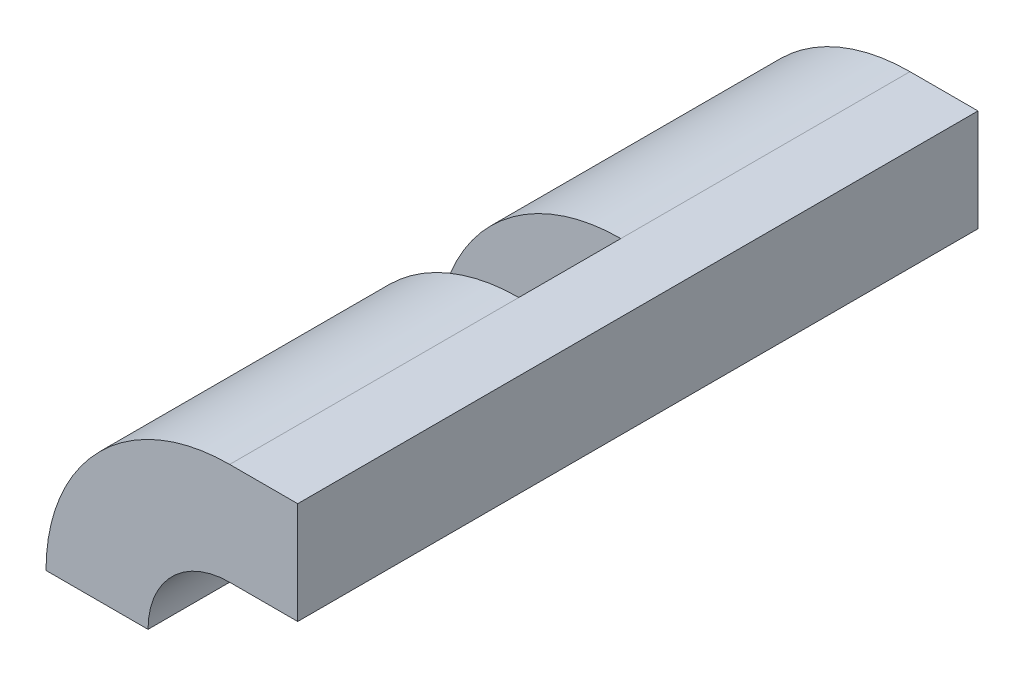
ISO-10303-21;
HEADER;
FILE_DESCRIPTION(('STEP AP214'),'2;1');
FILE_NAME('part.step','',(''),(''),'','','');
FILE_SCHEMA(('AUTOMOTIVE_DESIGN { 1 0 10303 214 1 1 1 1 }'));
ENDSEC;
DATA;
#1=APPLICATION_CONTEXT('core data for automotive mechanical design processes');
#2=APPLICATION_PROTOCOL_DEFINITION('international standard','automotive_design',2000,#1);
#3=PRODUCT_CONTEXT('',#1,'mechanical');
#4=PRODUCT('Part','Part','',(#3));
#5=PRODUCT_RELATED_PRODUCT_CATEGORY('part','',(#4));
#6=PRODUCT_DEFINITION_FORMATION('','',#4);
#7=PRODUCT_DEFINITION_CONTEXT('part definition',#1,'design');
#8=PRODUCT_DEFINITION('design','',#6,#7);
#9=PRODUCT_DEFINITION_SHAPE('','',#8);
#10=(LENGTH_UNIT() NAMED_UNIT(*) SI_UNIT(.MILLI.,.METRE.));
#11=(NAMED_UNIT(*) PLANE_ANGLE_UNIT() SI_UNIT($,.RADIAN.));
#12=(NAMED_UNIT(*) SI_UNIT($,.STERADIAN.) SOLID_ANGLE_UNIT());
#13=UNCERTAINTY_MEASURE_WITH_UNIT(LENGTH_MEASURE(1.E-05),#10,'distance_accuracy_value','');
#14=(GEOMETRIC_REPRESENTATION_CONTEXT(3) GLOBAL_UNCERTAINTY_ASSIGNED_CONTEXT((#13)) GLOBAL_UNIT_ASSIGNED_CONTEXT((#10,
#11,#12)) REPRESENTATION_CONTEXT('',''));
#15=CARTESIAN_POINT('',(0.,0.,0.));
#16=DIRECTION('',(0.,0.,1.));
#17=DIRECTION('',(1.,0.,0.));
#18=AXIS2_PLACEMENT_3D('',#15,#16,#17);
#19=CARTESIAN_POINT('',(-20.,-24.,200.));
#20=DIRECTION('',(0.,0.,-1.));
#21=DIRECTION('',(-1.,0.,0.));
#22=AXIS2_PLACEMENT_3D('',#19,#20,#21);
#23=CYLINDRICAL_SURFACE('',#22,54.);
#24=DIRECTION('',(0.,0.,-1.));
#25=VECTOR('',#24,1.);
#26=CARTESIAN_POINT('',(-74.,-24.,200.));
#27=LINE('',#26,#25);
#28=CARTESIAN_POINT('',(-74.,-24.,85.));
#29=VERTEX_POINT('',#28);
#30=CARTESIAN_POINT('',(-74.,-24.,0.));
#31=VERTEX_POINT('',#30);
#32=EDGE_CURVE('E131',#29,#31,#27,.T.);
#33=ORIENTED_EDGE('',*,*,#32,.F.);
#34=CARTESIAN_POINT('',(-20.,-24.,85.));
#35=DIRECTION('',(0.,0.,-1.));
#36=DIRECTION('',(-1.,0.,0.));
#37=AXIS2_PLACEMENT_3D('',#34,#35,#36);
#38=CIRCLE('',#37,54.);
#39=CARTESIAN_POINT('',(-20.,30.,85.));
#40=VERTEX_POINT('',#39);
#41=EDGE_CURVE('E149',#29,#40,#38,.T.);
#42=ORIENTED_EDGE('',*,*,#41,.T.);
#43=DIRECTION('',(0.,0.,-1.));
#44=VECTOR('',#43,1.);
#45=CARTESIAN_POINT('',(-20.,30.,200.));
#46=LINE('',#45,#44);
#47=CARTESIAN_POINT('',(-20.,30.,0.));
#48=VERTEX_POINT('',#47);
#49=EDGE_CURVE('E177',#40,#48,#46,.T.);
#50=ORIENTED_EDGE('',*,*,#49,.T.);
#51=CARTESIAN_POINT('',(-20.,-24.,0.));
#52=DIRECTION('',(0.,0.,1.));
#53=DIRECTION('',(1.,0.,0.));
#54=AXIS2_PLACEMENT_3D('',#51,#52,#53);
#55=CIRCLE('',#54,54.);
#56=EDGE_CURVE('E153',#48,#31,#55,.T.);
#57=ORIENTED_EDGE('',*,*,#56,.T.);
#58=EDGE_LOOP('',(#33,#42,#50,#57));
#59=FACE_BOUND('',#58,.T.);
#60=ADVANCED_FACE('F39',(#59),#23,.T.);
#61=CARTESIAN_POINT('',(-74.,-24.,200.));
#62=DIRECTION('',(0.,1.,0.));
#63=DIRECTION('',(0.,0.,1.));
#64=AXIS2_PLACEMENT_3D('',#61,#62,#63);
#65=PLANE('',#64);
#66=DIRECTION('',(0.,0.,-1.));
#67=VECTOR('',#66,1.);
#68=CARTESIAN_POINT('',(-44.,-24.,200.));
#69=LINE('',#68,#67);
#70=CARTESIAN_POINT('',(-44.,-24.,85.));
#71=VERTEX_POINT('',#70);
#72=CARTESIAN_POINT('',(-44.,-24.,0.));
#73=VERTEX_POINT('',#72);
#74=EDGE_CURVE('E132',#71,#73,#69,.T.);
#75=ORIENTED_EDGE('',*,*,#74,.F.);
#76=DIRECTION('',(-1.,0.,0.));
#77=VECTOR('',#76,1.);
#78=CARTESIAN_POINT('',(-20.,-24.,85.));
#79=LINE('',#78,#77);
#80=EDGE_CURVE('E215',#71,#29,#79,.T.);
#81=ORIENTED_EDGE('',*,*,#80,.T.);
#82=ORIENTED_EDGE('',*,*,#32,.T.);
#83=DIRECTION('',(1.,0.,0.));
#84=VECTOR('',#83,1.);
#85=CARTESIAN_POINT('',(-74.,-24.,0.));
#86=LINE('',#85,#84);
#87=EDGE_CURVE('E157',#31,#73,#86,.T.);
#88=ORIENTED_EDGE('',*,*,#87,.T.);
#89=EDGE_LOOP('',(#75,#81,#82,#88));
#90=FACE_BOUND('',#89,.T.);
#91=ADVANCED_FACE('F248',(#90),#65,.F.);
#92=CARTESIAN_POINT('',(-20.,-24.,200.));
#93=DIRECTION('',(0.,0.,-1.));
#94=DIRECTION('',(-1.,0.,0.));
#95=AXIS2_PLACEMENT_3D('',#92,#93,#94);
#96=CYLINDRICAL_SURFACE('',#95,24.);
#97=DIRECTION('',(0.,0.,-1.));
#98=VECTOR('',#97,1.);
#99=CARTESIAN_POINT('',(-20.,0.,200.));
#100=LINE('',#99,#98);
#101=CARTESIAN_POINT('',(-20.,0.,85.));
#102=VERTEX_POINT('',#101);
#103=CARTESIAN_POINT('',(-20.,0.,0.));
#104=VERTEX_POINT('',#103);
#105=EDGE_CURVE('E170',#102,#104,#100,.T.);
#106=ORIENTED_EDGE('',*,*,#105,.F.);
#107=CARTESIAN_POINT('',(-20.,-24.,85.));
#108=DIRECTION('',(0.,0.,-1.));
#109=DIRECTION('',(-1.,0.,0.));
#110=AXIS2_PLACEMENT_3D('',#107,#108,#109);
#111=CIRCLE('',#110,24.);
#112=EDGE_CURVE('E11',#102,#71,#111,.F.);
#113=ORIENTED_EDGE('',*,*,#112,.T.);
#114=ORIENTED_EDGE('',*,*,#74,.T.);
#115=CARTESIAN_POINT('',(-20.,-24.,0.));
#116=DIRECTION('',(0.,0.,-1.));
#117=DIRECTION('',(1.,0.,0.));
#118=AXIS2_PLACEMENT_3D('',#115,#116,#117);
#119=CIRCLE('',#118,24.);
#120=EDGE_CURVE('E161',#73,#104,#119,.T.);
#121=ORIENTED_EDGE('',*,*,#120,.T.);
#122=EDGE_LOOP('',(#106,#113,#114,#121));
#123=FACE_BOUND('',#122,.T.);
#124=ADVANCED_FACE('F247',(#123),#96,.F.);
#125=CARTESIAN_POINT('',(0.,0.,200.));
#126=DIRECTION('',(-1.,0.,0.));
#127=DIRECTION('',(0.,0.,1.));
#128=AXIS2_PLACEMENT_3D('',#125,#126,#127);
#129=PLANE('',#128);
#130=DIRECTION('',(0.,1.,0.));
#131=VECTOR('',#130,1.);
#132=CARTESIAN_POINT('',(0.,0.,0.));
#133=LINE('',#132,#131);
#134=CARTESIAN_POINT('',(0.,0.,0.));
#135=VERTEX_POINT('',#134);
#136=CARTESIAN_POINT('',(0.,30.,0.));
#137=VERTEX_POINT('',#136);
#138=EDGE_CURVE('E144',#135,#137,#133,.T.);
#139=ORIENTED_EDGE('',*,*,#138,.T.);
#140=DIRECTION('',(0.,0.,-1.));
#141=VECTOR('',#140,1.);
#142=CARTESIAN_POINT('',(0.,30.,200.));
#143=LINE('',#142,#141);
#144=CARTESIAN_POINT('',(0.,30.,200.));
#145=VERTEX_POINT('',#144);
#146=EDGE_CURVE('E182',#145,#137,#143,.T.);
#147=ORIENTED_EDGE('',*,*,#146,.F.);
#148=DIRECTION('',(0.,1.,0.));
#149=VECTOR('',#148,1.);
#150=CARTESIAN_POINT('',(0.,0.,200.));
#151=LINE('',#150,#149);
#152=CARTESIAN_POINT('',(0.,0.,200.));
#153=VERTEX_POINT('',#152);
#154=EDGE_CURVE('E167',#153,#145,#151,.T.);
#155=ORIENTED_EDGE('',*,*,#154,.F.);
#156=DIRECTION('',(0.,0.,-1.));
#157=VECTOR('',#156,1.);
#158=CARTESIAN_POINT('',(0.,0.,200.));
#159=LINE('',#158,#157);
#160=EDGE_CURVE('E140',#153,#135,#159,.T.);
#161=ORIENTED_EDGE('',*,*,#160,.T.);
#162=EDGE_LOOP('',(#139,#147,#155,#161));
#163=FACE_BOUND('',#162,.T.);
#164=ADVANCED_FACE('F41',(#163),#129,.F.);
#165=CARTESIAN_POINT('',(0.,30.,200.));
#166=DIRECTION('',(0.,-1.,0.));
#167=DIRECTION('',(1.,0.,0.));
#168=AXIS2_PLACEMENT_3D('',#165,#166,#167);
#169=PLANE('',#168);
#170=DIRECTION('',(-1.,0.,0.));
#171=VECTOR('',#170,1.);
#172=CARTESIAN_POINT('',(0.,30.,0.));
#173=LINE('',#172,#171);
#174=EDGE_CURVE('E148',#137,#48,#173,.T.);
#175=ORIENTED_EDGE('',*,*,#174,.T.);
#176=ORIENTED_EDGE('',*,*,#49,.F.);
#177=DIRECTION('',(0.,0.,-1.));
#178=VECTOR('',#177,1.);
#179=CARTESIAN_POINT('',(-20.,30.,200.));
#180=LINE('',#179,#178);
#181=CARTESIAN_POINT('',(-20.,30.,115.));
#182=VERTEX_POINT('',#181);
#183=EDGE_CURVE('E211',#40,#182,#180,.F.);
#184=ORIENTED_EDGE('',*,*,#183,.T.);
#185=CARTESIAN_POINT('',(-20.,30.,200.));
#186=VERTEX_POINT('',#185);
#187=EDGE_CURVE('E178',#186,#182,#46,.T.);
#188=ORIENTED_EDGE('',*,*,#187,.F.);
#189=DIRECTION('',(-1.,0.,0.));
#190=VECTOR('',#189,1.);
#191=CARTESIAN_POINT('',(0.,30.,200.));
#192=LINE('',#191,#190);
#193=EDGE_CURVE('E99',#145,#186,#192,.T.);
#194=ORIENTED_EDGE('',*,*,#193,.F.);
#195=ORIENTED_EDGE('',*,*,#146,.T.);
#196=EDGE_LOOP('',(#175,#176,#184,#188,#194,#195));
#197=FACE_BOUND('',#196,.T.);
#198=ADVANCED_FACE('F230',(#197),#169,.F.);
#199=ORIENTED_EDGE('',*,*,#187,.T.);
#200=CARTESIAN_POINT('',(-20.,-24.,115.));
#201=DIRECTION('',(0.,0.,1.));
#202=DIRECTION('',(1.,0.,0.));
#203=AXIS2_PLACEMENT_3D('',#200,#201,#202);
#204=CIRCLE('',#203,54.);
#205=CARTESIAN_POINT('',(-74.,-24.,115.));
#206=VERTEX_POINT('',#205);
#207=EDGE_CURVE('E207',#182,#206,#204,.T.);
#208=ORIENTED_EDGE('',*,*,#207,.T.);
#209=CARTESIAN_POINT('',(-74.,-24.,200.));
#210=VERTEX_POINT('',#209);
#211=EDGE_CURVE('E174',#210,#206,#27,.T.);
#212=ORIENTED_EDGE('',*,*,#211,.F.);
#213=CARTESIAN_POINT('',(-20.,-24.,200.));
#214=DIRECTION('',(0.,0.,1.));
#215=DIRECTION('',(1.,0.,0.));
#216=AXIS2_PLACEMENT_3D('',#213,#214,#215);
#217=CIRCLE('',#216,54.);
#218=EDGE_CURVE('E115',#186,#210,#217,.T.);
#219=ORIENTED_EDGE('',*,*,#218,.F.);
#220=EDGE_LOOP('',(#199,#208,#212,#219));
#221=FACE_BOUND('',#220,.T.);
#222=ADVANCED_FACE('F232',(#221),#23,.T.);
#223=ORIENTED_EDGE('',*,*,#211,.T.);
#224=DIRECTION('',(-1.,0.,0.));
#225=VECTOR('',#224,1.);
#226=CARTESIAN_POINT('',(-20.,-24.,115.));
#227=LINE('',#226,#225);
#228=CARTESIAN_POINT('',(-44.,-24.,115.));
#229=VERTEX_POINT('',#228);
#230=EDGE_CURVE('E127',#229,#206,#227,.T.);
#231=ORIENTED_EDGE('',*,*,#230,.F.);
#232=CARTESIAN_POINT('',(-44.,-24.,200.));
#233=VERTEX_POINT('',#232);
#234=EDGE_CURVE('E123',#233,#229,#69,.T.);
#235=ORIENTED_EDGE('',*,*,#234,.F.);
#236=DIRECTION('',(1.,0.,0.));
#237=VECTOR('',#236,1.);
#238=CARTESIAN_POINT('',(-74.,-24.,200.));
#239=LINE('',#238,#237);
#240=EDGE_CURVE('E108',#210,#233,#239,.T.);
#241=ORIENTED_EDGE('',*,*,#240,.F.);
#242=EDGE_LOOP('',(#223,#231,#235,#241));
#243=FACE_BOUND('',#242,.T.);
#244=ADVANCED_FACE('F124',(#243),#65,.F.);
#245=ORIENTED_EDGE('',*,*,#234,.T.);
#246=CARTESIAN_POINT('',(-20.,-24.,115.));
#247=DIRECTION('',(0.,0.,1.));
#248=DIRECTION('',(1.,0.,0.));
#249=AXIS2_PLACEMENT_3D('',#246,#247,#248);
#250=CIRCLE('',#249,24.);
#251=CARTESIAN_POINT('',(-20.,0.,115.));
#252=VERTEX_POINT('',#251);
#253=EDGE_CURVE('E48',#229,#252,#250,.F.);
#254=ORIENTED_EDGE('',*,*,#253,.T.);
#255=CARTESIAN_POINT('',(-20.,0.,200.));
#256=VERTEX_POINT('',#255);
#257=EDGE_CURVE('E136',#256,#252,#100,.T.);
#258=ORIENTED_EDGE('',*,*,#257,.F.);
#259=CARTESIAN_POINT('',(-20.,-24.,200.));
#260=DIRECTION('',(0.,0.,-1.));
#261=DIRECTION('',(1.,0.,0.));
#262=AXIS2_PLACEMENT_3D('',#259,#260,#261);
#263=CIRCLE('',#262,24.);
#264=EDGE_CURVE('E112',#233,#256,#263,.T.);
#265=ORIENTED_EDGE('',*,*,#264,.F.);
#266=EDGE_LOOP('',(#245,#254,#258,#265));
#267=FACE_BOUND('',#266,.T.);
#268=ADVANCED_FACE('F134',(#267),#96,.F.);
#269=CARTESIAN_POINT('',(0.,0.,200.));
#270=DIRECTION('',(0.,1.,0.));
#271=DIRECTION('',(0.,0.,1.));
#272=AXIS2_PLACEMENT_3D('',#269,#270,#271);
#273=PLANE('',#272);
#274=DIRECTION('',(1.,0.,0.));
#275=VECTOR('',#274,1.);
#276=CARTESIAN_POINT('',(0.,0.,0.));
#277=LINE('',#276,#275);
#278=EDGE_CURVE('E90',#104,#135,#277,.T.);
#279=ORIENTED_EDGE('',*,*,#278,.T.);
#280=ORIENTED_EDGE('',*,*,#160,.F.);
#281=DIRECTION('',(1.,0.,0.));
#282=VECTOR('',#281,1.);
#283=CARTESIAN_POINT('',(0.,0.,200.));
#284=LINE('',#283,#282);
#285=EDGE_CURVE('E64',#256,#153,#284,.T.);
#286=ORIENTED_EDGE('',*,*,#285,.F.);
#287=ORIENTED_EDGE('',*,*,#257,.T.);
#288=EDGE_CURVE('E172',#252,#102,#100,.T.);
#289=ORIENTED_EDGE('',*,*,#288,.T.);
#290=ORIENTED_EDGE('',*,*,#105,.T.);
#291=EDGE_LOOP('',(#279,#280,#286,#287,#289,#290));
#292=FACE_BOUND('',#291,.T.);
#293=ADVANCED_FACE('F193',(#292),#273,.F.);
#294=CARTESIAN_POINT('',(-20.,-24.,200.));
#295=DIRECTION('',(0.,0.,1.));
#296=DIRECTION('',(1.,0.,0.));
#297=AXIS2_PLACEMENT_3D('',#294,#295,#296);
#298=PLANE('',#297);
#299=ORIENTED_EDGE('',*,*,#154,.T.);
#300=ORIENTED_EDGE('',*,*,#193,.T.);
#301=ORIENTED_EDGE('',*,*,#218,.T.);
#302=ORIENTED_EDGE('',*,*,#240,.T.);
#303=ORIENTED_EDGE('',*,*,#264,.T.);
#304=ORIENTED_EDGE('',*,*,#285,.T.);
#305=EDGE_LOOP('',(#299,#300,#301,#302,#303,#304));
#306=FACE_BOUND('',#305,.T.);
#307=ADVANCED_FACE('F110',(#306),#298,.T.);
#308=CARTESIAN_POINT('',(-20.,-24.,0.));
#309=DIRECTION('',(0.,0.,1.));
#310=DIRECTION('',(1.,0.,0.));
#311=AXIS2_PLACEMENT_3D('',#308,#309,#310);
#312=PLANE('',#311);
#313=ORIENTED_EDGE('',*,*,#138,.F.);
#314=ORIENTED_EDGE('',*,*,#278,.F.);
#315=ORIENTED_EDGE('',*,*,#120,.F.);
#316=ORIENTED_EDGE('',*,*,#87,.F.);
#317=ORIENTED_EDGE('',*,*,#56,.F.);
#318=ORIENTED_EDGE('',*,*,#174,.F.);
#319=EDGE_LOOP('',(#313,#314,#315,#316,#317,#318));
#320=FACE_BOUND('',#319,.T.);
#321=ADVANCED_FACE('F256',(#320),#312,.F.);
#322=CARTESIAN_POINT('',(-20.,-24.,85.));
#323=DIRECTION('',(0.,0.,-1.));
#324=DIRECTION('',(-1.,0.,0.));
#325=AXIS2_PLACEMENT_3D('',#322,#323,#324);
#326=PLANE('',#325);
#327=ORIENTED_EDGE('',*,*,#80,.F.);
#328=ORIENTED_EDGE('',*,*,#112,.F.);
#329=DIRECTION('',(0.,-1.,0.));
#330=VECTOR('',#329,1.);
#331=CARTESIAN_POINT('',(-20.,-24.,85.));
#332=LINE('',#331,#330);
#333=EDGE_CURVE('E55',#40,#102,#332,.T.);
#334=ORIENTED_EDGE('',*,*,#333,.F.);
#335=ORIENTED_EDGE('',*,*,#41,.F.);
#336=EDGE_LOOP('',(#327,#328,#334,#335));
#337=FACE_BOUND('',#336,.T.);
#338=ADVANCED_FACE('F241',(#337),#326,.F.);
#339=CARTESIAN_POINT('',(-20.,34.0238891510296,115.));
#340=DIRECTION('',(0.,0.,1.));
#341=DIRECTION('',(1.,0.,0.));
#342=AXIS2_PLACEMENT_3D('',#339,#340,#341);
#343=PLANE('',#342);
#344=DIRECTION('',(0.,1.,0.));
#345=VECTOR('',#344,1.);
#346=CARTESIAN_POINT('',(-20.,34.0238891510296,115.));
#347=LINE('',#346,#345);
#348=EDGE_CURVE('E223',#252,#182,#347,.T.);
#349=ORIENTED_EDGE('',*,*,#348,.F.);
#350=ORIENTED_EDGE('',*,*,#253,.F.);
#351=ORIENTED_EDGE('',*,*,#230,.T.);
#352=ORIENTED_EDGE('',*,*,#207,.F.);
#353=EDGE_LOOP('',(#349,#350,#351,#352));
#354=FACE_BOUND('',#353,.T.);
#355=ADVANCED_FACE('F292',(#354),#343,.F.);
#356=CARTESIAN_POINT('',(-20.,0.,0.));
#357=DIRECTION('',(1.,0.,0.));
#358=DIRECTION('',(0.,0.,-1.));
#359=AXIS2_PLACEMENT_3D('',#356,#357,#358);
#360=PLANE('',#359);
#361=ORIENTED_EDGE('',*,*,#333,.T.);
#362=ORIENTED_EDGE('',*,*,#288,.F.);
#363=ORIENTED_EDGE('',*,*,#348,.T.);
#364=ORIENTED_EDGE('',*,*,#183,.F.);
#365=EDGE_LOOP('',(#361,#362,#363,#364));
#366=FACE_BOUND('',#365,.T.);
#367=ADVANCED_FACE('F226',(#366),#360,.F.);
#368=CLOSED_SHELL('',(#60,#91,#124,#164,#198,#222,#244,#268,#293,#307,#321,#338,#355,#367));
#369=MANIFOLD_SOLID_BREP('B2',#368);
#370=ADVANCED_BREP_SHAPE_REPRESENTATION('',(#18,#369),#14);
#371=SHAPE_DEFINITION_REPRESENTATION(#9,#370);
ENDSEC;
END-ISO-10303-21;
